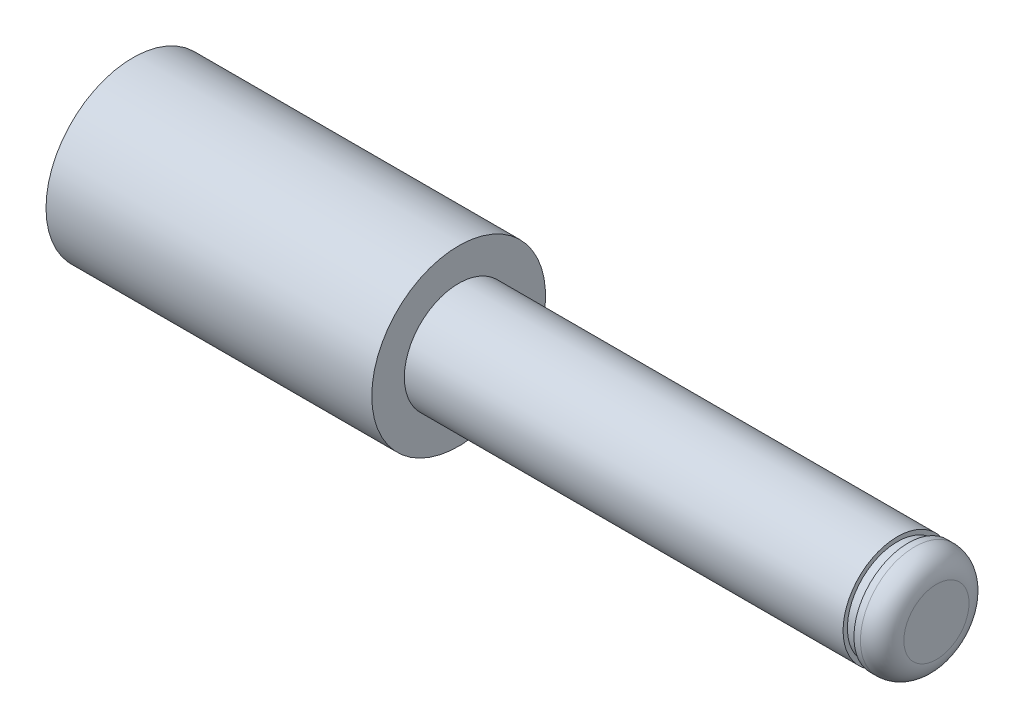
ISO-10303-21;
HEADER;
FILE_DESCRIPTION(('STEP AP214'),'2;1');
FILE_NAME('part.step','',(''),(''),'','','');
FILE_SCHEMA(('AUTOMOTIVE_DESIGN { 1 0 10303 214 1 1 1 1 }'));
ENDSEC;
DATA;
#1=APPLICATION_CONTEXT('core data for automotive mechanical design processes');
#2=APPLICATION_PROTOCOL_DEFINITION('international standard','automotive_design',2000,#1);
#3=PRODUCT_CONTEXT('',#1,'mechanical');
#4=PRODUCT('Part','Part','',(#3));
#5=PRODUCT_RELATED_PRODUCT_CATEGORY('part','',(#4));
#6=PRODUCT_DEFINITION_FORMATION('','',#4);
#7=PRODUCT_DEFINITION_CONTEXT('part definition',#1,'design');
#8=PRODUCT_DEFINITION('design','',#6,#7);
#9=PRODUCT_DEFINITION_SHAPE('','',#8);
#10=(LENGTH_UNIT() NAMED_UNIT(*) SI_UNIT(.MILLI.,.METRE.));
#11=(NAMED_UNIT(*) PLANE_ANGLE_UNIT() SI_UNIT($,.RADIAN.));
#12=(NAMED_UNIT(*) SI_UNIT($,.STERADIAN.) SOLID_ANGLE_UNIT());
#13=UNCERTAINTY_MEASURE_WITH_UNIT(LENGTH_MEASURE(1.E-05),#10,'distance_accuracy_value','');
#14=(GEOMETRIC_REPRESENTATION_CONTEXT(3) GLOBAL_UNCERTAINTY_ASSIGNED_CONTEXT((#13)) GLOBAL_UNIT_ASSIGNED_CONTEXT((#10,
#11,#12)) REPRESENTATION_CONTEXT('',''));
#15=CARTESIAN_POINT('',(0.,0.,0.));
#16=DIRECTION('',(0.,0.,1.));
#17=DIRECTION('',(1.,0.,0.));
#18=AXIS2_PLACEMENT_3D('',#15,#16,#17);
#19=CARTESIAN_POINT('',(-18.5,0.,0.));
#20=DIRECTION('',(-1.,0.,0.));
#21=DIRECTION('',(0.,0.,1.));
#22=AXIS2_PLACEMENT_3D('',#19,#20,#21);
#23=CYLINDRICAL_SURFACE('',#22,2.5);
#24=CARTESIAN_POINT('',(16.7,0.,0.));
#25=DIRECTION('',(1.,0.,0.));
#26=DIRECTION('',(0.,0.,-1.));
#27=AXIS2_PLACEMENT_3D('',#24,#25,#26);
#28=CIRCLE('',#27,2.5);
#29=CARTESIAN_POINT('',(16.7,0.,-2.5));
#30=VERTEX_POINT('',#29);
#31=EDGE_CURVE('E189',#30,#30,#28,.T.);
#32=ORIENTED_EDGE('',*,*,#31,.F.);
#33=EDGE_LOOP('',(#32));
#34=FACE_BOUND('',#33,.T.);
#35=CARTESIAN_POINT('',(-3.5,0.,0.));
#36=DIRECTION('',(-1.,0.,0.));
#37=DIRECTION('',(0.,0.,1.));
#38=AXIS2_PLACEMENT_3D('',#35,#36,#37);
#39=CIRCLE('',#38,2.5);
#40=CARTESIAN_POINT('',(-3.5,0.,2.5));
#41=VERTEX_POINT('',#40);
#42=EDGE_CURVE('E37',#41,#41,#39,.T.);
#43=ORIENTED_EDGE('',*,*,#42,.F.);
#44=EDGE_LOOP('',(#43));
#45=FACE_BOUND('',#44,.T.);
#46=ADVANCED_FACE('F17',(#34,#45),#23,.T.);
#47=CARTESIAN_POINT('',(-18.5,0.,0.));
#48=DIRECTION('',(-1.,0.,0.));
#49=DIRECTION('',(0.,0.,1.));
#50=AXIS2_PLACEMENT_3D('',#47,#48,#49);
#51=PLANE('',#50);
#52=CARTESIAN_POINT('',(-18.5,0.,0.));
#53=DIRECTION('',(-1.,0.,0.));
#54=DIRECTION('',(0.,0.,1.));
#55=AXIS2_PLACEMENT_3D('',#52,#53,#54);
#56=CIRCLE('',#55,2.1);
#57=CARTESIAN_POINT('',(-18.5,0.,2.1));
#58=VERTEX_POINT('',#57);
#59=EDGE_CURVE('E38',#58,#58,#56,.T.);
#60=ORIENTED_EDGE('',*,*,#59,.F.);
#61=EDGE_LOOP('',(#60));
#62=FACE_BOUND('',#61,.T.);
#63=CARTESIAN_POINT('',(-18.5,0.,0.));
#64=DIRECTION('',(-1.,0.,0.));
#65=DIRECTION('',(0.,0.,1.));
#66=AXIS2_PLACEMENT_3D('',#63,#64,#65);
#67=CIRCLE('',#66,4.);
#68=CARTESIAN_POINT('',(-18.5,0.,4.));
#69=VERTEX_POINT('',#68);
#70=EDGE_CURVE('E50',#69,#69,#67,.T.);
#71=ORIENTED_EDGE('',*,*,#70,.T.);
#72=EDGE_LOOP('',(#71));
#73=FACE_BOUND('',#72,.T.);
#74=ADVANCED_FACE('F73',(#62,#73),#51,.T.);
#75=CARTESIAN_POINT('',(-18.5,0.,0.));
#76=DIRECTION('',(-1.,0.,0.));
#77=DIRECTION('',(0.,0.,1.));
#78=AXIS2_PLACEMENT_3D('',#75,#76,#77);
#79=CYLINDRICAL_SURFACE('',#78,4.);
#80=CARTESIAN_POINT('',(-3.5,0.,0.));
#81=DIRECTION('',(-1.,0.,0.));
#82=DIRECTION('',(0.,0.,1.));
#83=AXIS2_PLACEMENT_3D('',#80,#81,#82);
#84=CIRCLE('',#83,4.);
#85=CARTESIAN_POINT('',(-3.5,0.,4.));
#86=VERTEX_POINT('',#85);
#87=EDGE_CURVE('E41',#86,#86,#84,.T.);
#88=ORIENTED_EDGE('',*,*,#87,.T.);
#89=EDGE_LOOP('',(#88));
#90=FACE_BOUND('',#89,.T.);
#91=ORIENTED_EDGE('',*,*,#70,.F.);
#92=EDGE_LOOP('',(#91));
#93=FACE_BOUND('',#92,.T.);
#94=ADVANCED_FACE('F79',(#90,#93),#79,.T.);
#95=CARTESIAN_POINT('',(-3.5,-4.,0.));
#96=DIRECTION('',(1.,0.,0.));
#97=DIRECTION('',(0.,0.,-1.));
#98=AXIS2_PLACEMENT_3D('',#95,#96,#97);
#99=PLANE('',#98);
#100=ORIENTED_EDGE('',*,*,#42,.T.);
#101=EDGE_LOOP('',(#100));
#102=FACE_BOUND('',#101,.T.);
#103=ORIENTED_EDGE('',*,*,#87,.F.);
#104=EDGE_LOOP('',(#103));
#105=FACE_BOUND('',#104,.T.);
#106=ADVANCED_FACE('F31',(#102,#105),#99,.T.);
#107=CARTESIAN_POINT('',(-8.5,0.,0.));
#108=DIRECTION('',(-1.,0.,0.));
#109=DIRECTION('',(0.,0.,1.));
#110=AXIS2_PLACEMENT_3D('',#107,#108,#109);
#111=CONICAL_SURFACE('',#110,2.1,1.02974425867665);
#112=CARTESIAN_POINT('',(-7.23819270004213,0.,0.));
#113=VERTEX_POINT('',#112);
#114=VERTEX_LOOP('',#113);
#115=FACE_BOUND('',#114,.T.);
#116=CARTESIAN_POINT('',(-8.5,0.,0.));
#117=DIRECTION('',(-1.,0.,0.));
#118=DIRECTION('',(0.,0.,1.));
#119=AXIS2_PLACEMENT_3D('',#116,#117,#118);
#120=CIRCLE('',#119,2.1);
#121=CARTESIAN_POINT('',(-8.5,0.,2.1));
#122=VERTEX_POINT('',#121);
#123=EDGE_CURVE('E35',#122,#122,#120,.T.);
#124=ORIENTED_EDGE('',*,*,#123,.T.);
#125=EDGE_LOOP('',(#124));
#126=FACE_BOUND('',#125,.T.);
#127=ADVANCED_FACE('F27',(#115,#126),#111,.F.);
#128=CARTESIAN_POINT('',(-18.5,0.,0.));
#129=DIRECTION('',(-1.,0.,0.));
#130=DIRECTION('',(0.,0.,1.));
#131=AXIS2_PLACEMENT_3D('',#128,#129,#130);
#132=CYLINDRICAL_SURFACE('',#131,2.1);
#133=ORIENTED_EDGE('',*,*,#123,.F.);
#134=EDGE_LOOP('',(#133));
#135=FACE_BOUND('',#134,.T.);
#136=ORIENTED_EDGE('',*,*,#59,.T.);
#137=EDGE_LOOP('',(#136));
#138=FACE_BOUND('',#137,.T.);
#139=ADVANCED_FACE('F30',(#135,#138),#132,.F.);
#140=CARTESIAN_POINT('',(16.7,2.5,0.));
#141=DIRECTION('',(-1.,0.,0.));
#142=DIRECTION('',(0.,0.,1.));
#143=AXIS2_PLACEMENT_3D('',#140,#141,#142);
#144=PLANE('',#143);
#145=CARTESIAN_POINT('',(16.7,0.,0.));
#146=DIRECTION('',(1.,0.,0.));
#147=DIRECTION('',(0.,0.,-1.));
#148=AXIS2_PLACEMENT_3D('',#145,#146,#147);
#149=CIRCLE('',#148,2.3);
#150=CARTESIAN_POINT('',(16.7,0.,-2.3));
#151=VERTEX_POINT('',#150);
#152=EDGE_CURVE('E44',#151,#151,#149,.T.);
#153=ORIENTED_EDGE('',*,*,#152,.F.);
#154=EDGE_LOOP('',(#153));
#155=FACE_BOUND('',#154,.T.);
#156=ORIENTED_EDGE('',*,*,#31,.T.);
#157=EDGE_LOOP('',(#156));
#158=FACE_BOUND('',#157,.T.);
#159=ADVANCED_FACE('F120',(#155,#158),#144,.F.);
#160=CARTESIAN_POINT('',(18.5,0.,0.));
#161=DIRECTION('',(1.,0.,0.));
#162=DIRECTION('',(0.,0.,-1.));
#163=AXIS2_PLACEMENT_3D('',#160,#161,#162);
#164=CYLINDRICAL_SURFACE('',#163,2.3);
#165=CARTESIAN_POINT('',(17.2,0.,0.));
#166=DIRECTION('',(1.,0.,0.));
#167=DIRECTION('',(0.,0.,-1.));
#168=AXIS2_PLACEMENT_3D('',#165,#166,#167);
#169=CIRCLE('',#168,2.3);
#170=CARTESIAN_POINT('',(17.2,0.,-2.3));
#171=VERTEX_POINT('',#170);
#172=EDGE_CURVE('E186',#171,#171,#169,.T.);
#173=ORIENTED_EDGE('',*,*,#172,.F.);
#174=EDGE_LOOP('',(#173));
#175=FACE_BOUND('',#174,.T.);
#176=ORIENTED_EDGE('',*,*,#152,.T.);
#177=EDGE_LOOP('',(#176));
#178=FACE_BOUND('',#177,.T.);
#179=ADVANCED_FACE('F128',(#175,#178),#164,.T.);
#180=CARTESIAN_POINT('',(17.2,2.5,0.));
#181=DIRECTION('',(1.,0.,0.));
#182=DIRECTION('',(0.,0.,-1.));
#183=AXIS2_PLACEMENT_3D('',#180,#181,#182);
#184=PLANE('',#183);
#185=CARTESIAN_POINT('',(17.2,0.,0.));
#186=DIRECTION('',(1.,0.,0.));
#187=DIRECTION('',(0.,0.,-1.));
#188=AXIS2_PLACEMENT_3D('',#185,#186,#187);
#189=CIRCLE('',#188,2.5);
#190=CARTESIAN_POINT('',(17.2,0.,-2.5));
#191=VERTEX_POINT('',#190);
#192=EDGE_CURVE('E183',#191,#191,#189,.T.);
#193=ORIENTED_EDGE('',*,*,#192,.F.);
#194=EDGE_LOOP('',(#193));
#195=FACE_BOUND('',#194,.T.);
#196=ORIENTED_EDGE('',*,*,#172,.T.);
#197=EDGE_LOOP('',(#196));
#198=FACE_BOUND('',#197,.T.);
#199=ADVANCED_FACE('F68',(#195,#198),#184,.F.);
#200=CARTESIAN_POINT('',(18.5,-2.5,0.));
#201=DIRECTION('',(1.,0.,0.));
#202=DIRECTION('',(0.,0.,-1.));
#203=AXIS2_PLACEMENT_3D('',#200,#201,#202);
#204=PLANE('',#203);
#205=CARTESIAN_POINT('',(18.5,0.,0.));
#206=DIRECTION('',(1.,0.,0.));
#207=DIRECTION('',(0.,0.,-1.));
#208=AXIS2_PLACEMENT_3D('',#205,#206,#207);
#209=CIRCLE('',#208,1.5);
#210=CARTESIAN_POINT('',(18.5,0.,-1.5));
#211=VERTEX_POINT('',#210);
#212=EDGE_CURVE('E11',#211,#211,#209,.T.);
#213=ORIENTED_EDGE('',*,*,#212,.T.);
#214=EDGE_LOOP('',(#213));
#215=FACE_BOUND('',#214,.T.);
#216=ADVANCED_FACE('F58',(#215),#204,.T.);
#217=CARTESIAN_POINT('',(17.5,0.,0.));
#218=DIRECTION('',(1.,0.,0.));
#219=DIRECTION('',(0.,0.,-1.));
#220=AXIS2_PLACEMENT_3D('',#217,#218,#219);
#221=TOROIDAL_SURFACE('',#220,1.5,1.);
#222=ORIENTED_EDGE('',*,*,#212,.F.);
#223=EDGE_LOOP('',(#222));
#224=FACE_BOUND('',#223,.T.);
#225=CARTESIAN_POINT('',(17.5,0.,0.));
#226=DIRECTION('',(1.,0.,0.));
#227=DIRECTION('',(0.,0.,-1.));
#228=AXIS2_PLACEMENT_3D('',#225,#226,#227);
#229=CIRCLE('',#228,2.5);
#230=CARTESIAN_POINT('',(17.5,0.,-2.5));
#231=VERTEX_POINT('',#230);
#232=EDGE_CURVE('E24',#231,#231,#229,.F.);
#233=ORIENTED_EDGE('',*,*,#232,.F.);
#234=EDGE_LOOP('',(#233));
#235=FACE_BOUND('',#234,.T.);
#236=ADVANCED_FACE('F19',(#224,#235),#221,.T.);
#237=ORIENTED_EDGE('',*,*,#192,.T.);
#238=EDGE_LOOP('',(#237));
#239=FACE_BOUND('',#238,.T.);
#240=ORIENTED_EDGE('',*,*,#232,.T.);
#241=EDGE_LOOP('',(#240));
#242=FACE_BOUND('',#241,.T.);
#243=ADVANCED_FACE('F55',(#239,#242),#23,.T.);
#244=CLOSED_SHELL('',(#46,#74,#94,#106,#127,#139,#159,#179,#199,#216,#236,#243));
#245=MANIFOLD_SOLID_BREP('B1',#244);
#246=ADVANCED_BREP_SHAPE_REPRESENTATION('',(#18,#245),#14);
#247=SHAPE_DEFINITION_REPRESENTATION(#9,#246);
ENDSEC;
END-ISO-10303-21;
